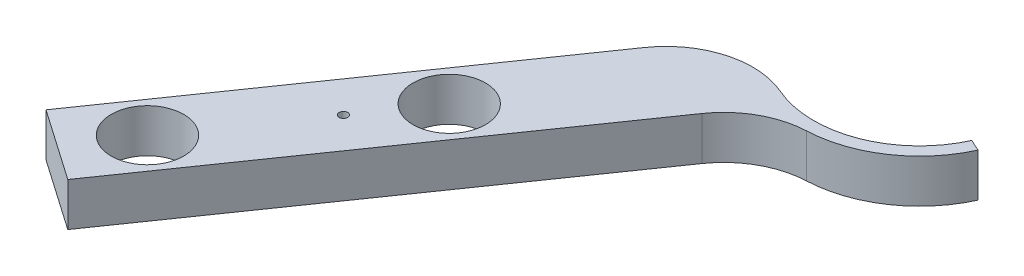
ISO-10303-21;
HEADER;
FILE_DESCRIPTION(('STEP AP214'),'2;1');
FILE_NAME('part.step','',(''),(''),'','','');
FILE_SCHEMA(('AUTOMOTIVE_DESIGN { 1 0 10303 214 1 1 1 1 }'));
ENDSEC;
DATA;
#1=APPLICATION_CONTEXT('core data for automotive mechanical design processes');
#2=APPLICATION_PROTOCOL_DEFINITION('international standard','automotive_design',2000,#1);
#3=PRODUCT_CONTEXT('',#1,'mechanical');
#4=PRODUCT('Part','Part','',(#3));
#5=PRODUCT_RELATED_PRODUCT_CATEGORY('part','',(#4));
#6=PRODUCT_DEFINITION_FORMATION('','',#4);
#7=PRODUCT_DEFINITION_CONTEXT('part definition',#1,'design');
#8=PRODUCT_DEFINITION('design','',#6,#7);
#9=PRODUCT_DEFINITION_SHAPE('','',#8);
#10=(LENGTH_UNIT() NAMED_UNIT(*) SI_UNIT(.MILLI.,.METRE.));
#11=(NAMED_UNIT(*) PLANE_ANGLE_UNIT() SI_UNIT($,.RADIAN.));
#12=(NAMED_UNIT(*) SI_UNIT($,.STERADIAN.) SOLID_ANGLE_UNIT());
#13=UNCERTAINTY_MEASURE_WITH_UNIT(LENGTH_MEASURE(1.E-05),#10,'distance_accuracy_value','');
#14=(GEOMETRIC_REPRESENTATION_CONTEXT(3) GLOBAL_UNCERTAINTY_ASSIGNED_CONTEXT((#13)) GLOBAL_UNIT_ASSIGNED_CONTEXT((#10,
#11,#12)) REPRESENTATION_CONTEXT('',''));
#15=CARTESIAN_POINT('',(0.,0.,0.));
#16=DIRECTION('',(0.,0.,1.));
#17=DIRECTION('',(1.,0.,0.));
#18=AXIS2_PLACEMENT_3D('',#15,#16,#17);
#19=CARTESIAN_POINT('',(-20.9324494362962,5.,30.1441549069458));
#20=DIRECTION('',(-0.570377582984847,0.,0.821382622672506));
#21=DIRECTION('',(0.821382622672506,0.,0.570377582984847));
#22=AXIS2_PLACEMENT_3D('',#19,#20,#21);
#23=PLANE('',#22);
#24=DIRECTION('',(0.,1.,0.));
#25=VECTOR('',#24,1.);
#26=CARTESIAN_POINT('',(-16.8255363229338,0.,32.9960428218699));
#27=LINE('',#26,#25);
#28=CARTESIAN_POINT('',(-16.8255363229338,0.,32.9960428218699));
#29=VERTEX_POINT('',#28);
#30=CARTESIAN_POINT('',(-16.8255363229338,5.,32.9960428218699));
#31=VERTEX_POINT('',#30);
#32=EDGE_CURVE('E107',#29,#31,#27,.T.);
#33=ORIENTED_EDGE('',*,*,#32,.F.);
#34=DIRECTION('',(-0.821382622672506,0.,-0.570377582984847));
#35=VECTOR('',#34,1.);
#36=CARTESIAN_POINT('',(-20.9324494362962,0.,30.1441549069458));
#37=LINE('',#36,#35);
#38=CARTESIAN_POINT('',(-8.61171009620893,0.,38.6998186517183));
#39=VERTEX_POINT('',#38);
#40=EDGE_CURVE('E118',#39,#29,#37,.T.);
#41=ORIENTED_EDGE('',*,*,#40,.F.);
#42=DIRECTION('',(0.,-1.,0.));
#43=VECTOR('',#42,1.);
#44=CARTESIAN_POINT('',(-8.61171009620893,5.,38.6998186517183));
#45=LINE('',#44,#43);
#46=CARTESIAN_POINT('',(-8.61171009620893,5.,38.6998186517183));
#47=VERTEX_POINT('',#46);
#48=EDGE_CURVE('E136',#47,#39,#45,.T.);
#49=ORIENTED_EDGE('',*,*,#48,.F.);
#50=DIRECTION('',(-0.821382622672506,0.,-0.570377582984847));
#51=VECTOR('',#50,1.);
#52=CARTESIAN_POINT('',(-20.9324494362962,5.,30.1441549069458));
#53=LINE('',#52,#51);
#54=EDGE_CURVE('E120',#47,#31,#53,.T.);
#55=ORIENTED_EDGE('',*,*,#54,.T.);
#56=EDGE_LOOP('',(#33,#41,#49,#55));
#57=FACE_BOUND('',#56,.T.);
#58=ADVANCED_FACE('F41',(#57),#23,.T.);
#59=CARTESIAN_POINT('',(0.,5.,0.));
#60=DIRECTION('',(0.,1.,0.));
#61=DIRECTION('',(0.,0.,1.));
#62=AXIS2_PLACEMENT_3D('',#59,#60,#61);
#63=PLANE('',#62);
#64=CARTESIAN_POINT('',(28.5028160348005,5.,-22.3766137246644));
#65=DIRECTION('',(0.,-1.,0.));
#66=DIRECTION('',(-0.9369964700514,0.,0.34933882565672));
#67=AXIS2_PLACEMENT_3D('',#64,#65,#66);
#68=CIRCLE('',#67,12.1999999999996);
#69=CARTESIAN_POINT('',(39.599648242593,5.,-17.30706591918));
#70=VERTEX_POINT('',#69);
#71=CARTESIAN_POINT('',(23.6433728637027,5.,-11.1861797711994));
#72=VERTEX_POINT('',#71);
#73=EDGE_CURVE('E194',#70,#72,#68,.T.);
#74=ORIENTED_EDGE('',*,*,#73,.T.);
#75=CARTESIAN_POINT('',(19.6602227234585,5.,-2.01369292409668));
#76=DIRECTION('',(0.,1.,0.));
#77=DIRECTION('',(0.,0.,1.));
#78=AXIS2_PLACEMENT_3D('',#75,#76,#77);
#79=CIRCLE('',#78,10.);
#80=CARTESIAN_POINT('',(11.4463964967335,5.,-7.71746875394519));
#81=VERTEX_POINT('',#80);
#82=EDGE_CURVE('E65',#72,#81,#79,.T.);
#83=ORIENTED_EDGE('',*,*,#82,.T.);
#84=DIRECTION('',(0.57037758298485,0.,-0.821382622672504));
#85=VECTOR('',#84,1.);
#86=CARTESIAN_POINT('',(4.10691311336246,5.,2.85188791492421));
#87=LINE('',#86,#85);
#88=EDGE_CURVE('E190',#31,#81,#87,.T.);
#89=ORIENTED_EDGE('',*,*,#88,.F.);
#90=ORIENTED_EDGE('',*,*,#54,.F.);
#91=DIRECTION('',(0.570377582984853,0.,-0.821382622672501));
#92=VECTOR('',#91,1.);
#93=CARTESIAN_POINT('',(12.3207393400874,5.,8.55566374477269));
#94=LINE('',#93,#92);
#95=CARTESIAN_POINT('',(21.3550995541448,5.,-4.45443116105676));
#96=VERTEX_POINT('',#95);
#97=EDGE_CURVE('E177',#47,#96,#94,.T.);
#98=ORIENTED_EDGE('',*,*,#97,.T.);
#99=CARTESIAN_POINT('',(29.5689257808698,5.,1.24934466879177));
#100=DIRECTION('',(0.,1.,0.));
#101=DIRECTION('',(0.,0.,1.));
#102=AXIS2_PLACEMENT_3D('',#99,#100,#101);
#103=CIRCLE('',#102,10.);
#104=CARTESIAN_POINT('',(29.1181394188955,5.,-8.74048974704606));
#105=VERTEX_POINT('',#104);
#106=EDGE_CURVE('E11',#96,#105,#103,.F.);
#107=ORIENTED_EDGE('',*,*,#106,.T.);
#108=CARTESIAN_POINT('',(28.5028160348005,5.,-22.3766137246644));
#109=DIRECTION('',(0.,-1.,0.));
#110=DIRECTION('',(-0.9369964700514,0.,0.34933882565672));
#111=AXIS2_PLACEMENT_3D('',#108,#109,#110);
#112=CIRCLE('',#111,13.6499999999997);
#113=CARTESIAN_POINT('',(40.9185340377765,5.,-16.7045376963993));
#114=VERTEX_POINT('',#113);
#115=EDGE_CURVE('E176',#114,#105,#112,.T.);
#116=ORIENTED_EDGE('',*,*,#115,.F.);
#117=DIRECTION('',(-0.909576410474816,0.,-0.415536705367587));
#118=VECTOR('',#117,1.);
#119=CARTESIAN_POINT('',(22.330472389426,5.,-25.19642667634));
#120=LINE('',#119,#118);
#121=EDGE_CURVE('E219',#114,#70,#120,.T.);
#122=ORIENTED_EDGE('',*,*,#121,.T.);
#123=EDGE_LOOP('',(#74,#83,#89,#90,#98,#107,#116,#122));
#124=FACE_BOUND('',#123,.T.);
#125=CARTESIAN_POINT('',(0.832992511570855,5.,16.3624609061356));
#126=DIRECTION('',(0.,-1.,0.));
#127=DIRECTION('',(-0.9369964700514,0.,0.34933882565672));
#128=AXIS2_PLACEMENT_3D('',#125,#126,#127);
#129=CIRCLE('',#128,0.500000000000001);
#130=CARTESIAN_POINT('',(0.364494276545154,5.,16.537130318964));
#131=VERTEX_POINT('',#130);
#132=EDGE_CURVE('E122',#131,#131,#129,.T.);
#133=ORIENTED_EDGE('',*,*,#132,.T.);
#134=EDGE_LOOP('',(#133));
#135=FACE_BOUND('',#134,.T.);
#136=CARTESIAN_POINT('',(5.81864823743628,5.,9.15299549993773));
#137=DIRECTION('',(0.,-1.,0.));
#138=DIRECTION('',(-0.9369964700514,0.,0.34933882565672));
#139=AXIS2_PLACEMENT_3D('',#136,#137,#138);
#140=CIRCLE('',#139,4.175);
#141=CARTESIAN_POINT('',(1.90668797497168,5.,10.6114850970545));
#142=VERTEX_POINT('',#141);
#143=EDGE_CURVE('E183',#142,#142,#140,.T.);
#144=ORIENTED_EDGE('',*,*,#143,.T.);
#145=EDGE_LOOP('',(#144));
#146=FACE_BOUND('',#145,.T.);
#147=CARTESIAN_POINT('',(-8.44079133718505,5.,29.6875610667503));
#148=DIRECTION('',(0.,-1.,0.));
#149=DIRECTION('',(-0.9369964700514,0.,0.34933882565672));
#150=AXIS2_PLACEMENT_3D('',#147,#148,#149);
#151=CIRCLE('',#150,4.175);
#152=CARTESIAN_POINT('',(-12.3527515996496,5.,31.1460506638671));
#153=VERTEX_POINT('',#152);
#154=EDGE_CURVE('E188',#153,#153,#151,.T.);
#155=ORIENTED_EDGE('',*,*,#154,.T.);
#156=EDGE_LOOP('',(#155));
#157=FACE_BOUND('',#156,.T.);
#158=ADVANCED_FACE('F173',(#124,#135,#146,#157),#63,.T.);
#159=CARTESIAN_POINT('',(0.,0.,0.));
#160=DIRECTION('',(0.,1.,0.));
#161=DIRECTION('',(0.,0.,1.));
#162=AXIS2_PLACEMENT_3D('',#159,#160,#161);
#163=PLANE('',#162);
#164=CARTESIAN_POINT('',(0.832992511570855,0.,16.3624609061356));
#165=DIRECTION('',(0.,-1.,0.));
#166=DIRECTION('',(-0.9369964700514,0.,0.34933882565672));
#167=AXIS2_PLACEMENT_3D('',#164,#165,#166);
#168=CIRCLE('',#167,0.500000000000001);
#169=CARTESIAN_POINT('',(0.364494276545154,0.,16.537130318964));
#170=VERTEX_POINT('',#169);
#171=EDGE_CURVE('E205',#170,#170,#168,.T.);
#172=ORIENTED_EDGE('',*,*,#171,.F.);
#173=EDGE_LOOP('',(#172));
#174=FACE_BOUND('',#173,.T.);
#175=DIRECTION('',(0.57037758298485,0.,-0.821382622672504));
#176=VECTOR('',#175,1.);
#177=CARTESIAN_POINT('',(4.10691311336246,0.,2.85188791492421));
#178=LINE('',#177,#176);
#179=CARTESIAN_POINT('',(11.4463964967335,0.,-7.71746875394519));
#180=VERTEX_POINT('',#179);
#181=EDGE_CURVE('E104',#29,#180,#178,.T.);
#182=ORIENTED_EDGE('',*,*,#181,.T.);
#183=CARTESIAN_POINT('',(19.6602227234585,0.,-2.01369292409668));
#184=DIRECTION('',(0.,1.,0.));
#185=DIRECTION('',(0.,0.,1.));
#186=AXIS2_PLACEMENT_3D('',#183,#184,#185);
#187=CIRCLE('',#186,10.);
#188=CARTESIAN_POINT('',(23.6433728637027,0.,-11.1861797711994));
#189=VERTEX_POINT('',#188);
#190=EDGE_CURVE('E153',#180,#189,#187,.F.);
#191=ORIENTED_EDGE('',*,*,#190,.T.);
#192=CARTESIAN_POINT('',(28.5028160348005,0.,-22.3766137246644));
#193=DIRECTION('',(0.,-1.,0.));
#194=DIRECTION('',(-0.9369964700514,0.,0.34933882565672));
#195=AXIS2_PLACEMENT_3D('',#192,#193,#194);
#196=CIRCLE('',#195,12.1999999999996);
#197=CARTESIAN_POINT('',(39.599648242593,0.,-17.30706591918));
#198=VERTEX_POINT('',#197);
#199=EDGE_CURVE('E114',#198,#189,#196,.T.);
#200=ORIENTED_EDGE('',*,*,#199,.F.);
#201=DIRECTION('',(-0.909576410474816,0.,-0.415536705367587));
#202=VECTOR('',#201,1.);
#203=CARTESIAN_POINT('',(22.330472389426,0.,-25.19642667634));
#204=LINE('',#203,#202);
#205=CARTESIAN_POINT('',(40.9185340377765,0.,-16.7045376963993));
#206=VERTEX_POINT('',#205);
#207=EDGE_CURVE('E201',#206,#198,#204,.T.);
#208=ORIENTED_EDGE('',*,*,#207,.F.);
#209=CARTESIAN_POINT('',(28.5028160348005,0.,-22.3766137246644));
#210=DIRECTION('',(0.,-1.,0.));
#211=DIRECTION('',(-0.9369964700514,0.,0.34933882565672));
#212=AXIS2_PLACEMENT_3D('',#209,#210,#211);
#213=CIRCLE('',#212,13.6499999999997);
#214=CARTESIAN_POINT('',(29.1181394188955,0.,-8.74048974704606));
#215=VERTEX_POINT('',#214);
#216=EDGE_CURVE('E159',#206,#215,#213,.T.);
#217=ORIENTED_EDGE('',*,*,#216,.T.);
#218=CARTESIAN_POINT('',(29.5689257808698,0.,1.24934466879177));
#219=DIRECTION('',(0.,1.,0.));
#220=DIRECTION('',(0.,0.,1.));
#221=AXIS2_PLACEMENT_3D('',#218,#219,#220);
#222=CIRCLE('',#221,10.);
#223=CARTESIAN_POINT('',(21.3550995541448,0.,-4.45443116105676));
#224=VERTEX_POINT('',#223);
#225=EDGE_CURVE('E50',#215,#224,#222,.T.);
#226=ORIENTED_EDGE('',*,*,#225,.T.);
#227=DIRECTION('',(0.570377582984853,0.,-0.821382622672501));
#228=VECTOR('',#227,1.);
#229=CARTESIAN_POINT('',(12.3207393400874,0.,8.55566374477269));
#230=LINE('',#229,#228);
#231=EDGE_CURVE('E113',#39,#224,#230,.T.);
#232=ORIENTED_EDGE('',*,*,#231,.F.);
#233=ORIENTED_EDGE('',*,*,#40,.T.);
#234=EDGE_LOOP('',(#182,#191,#200,#208,#217,#226,#232,#233));
#235=FACE_BOUND('',#234,.T.);
#236=CARTESIAN_POINT('',(5.81864823743628,0.,9.15299549993773));
#237=DIRECTION('',(0.,-1.,0.));
#238=DIRECTION('',(-0.9369964700514,0.,0.34933882565672));
#239=AXIS2_PLACEMENT_3D('',#236,#237,#238);
#240=CIRCLE('',#239,4.175);
#241=CARTESIAN_POINT('',(1.90668797497168,0.,10.6114850970545));
#242=VERTEX_POINT('',#241);
#243=EDGE_CURVE('E210',#242,#242,#240,.T.);
#244=ORIENTED_EDGE('',*,*,#243,.F.);
#245=EDGE_LOOP('',(#244));
#246=FACE_BOUND('',#245,.T.);
#247=CARTESIAN_POINT('',(-8.44079133718505,0.,29.6875610667503));
#248=DIRECTION('',(0.,-1.,0.));
#249=DIRECTION('',(-0.9369964700514,0.,0.34933882565672));
#250=AXIS2_PLACEMENT_3D('',#247,#248,#249);
#251=CIRCLE('',#250,4.175);
#252=CARTESIAN_POINT('',(-12.3527515996496,0.,31.1460506638671));
#253=VERTEX_POINT('',#252);
#254=EDGE_CURVE('E215',#253,#253,#251,.T.);
#255=ORIENTED_EDGE('',*,*,#254,.F.);
#256=EDGE_LOOP('',(#255));
#257=FACE_BOUND('',#256,.T.);
#258=ADVANCED_FACE('F125',(#174,#235,#246,#257),#163,.F.);
#259=CARTESIAN_POINT('',(22.330472389426,5.,-25.19642667634));
#260=DIRECTION('',(-0.415536705367587,0.,0.909576410474816));
#261=DIRECTION('',(0.909576410474816,0.,0.415536705367587));
#262=AXIS2_PLACEMENT_3D('',#259,#260,#261);
#263=PLANE('',#262);
#264=ORIENTED_EDGE('',*,*,#207,.T.);
#265=DIRECTION('',(0.,-1.,0.));
#266=VECTOR('',#265,1.);
#267=CARTESIAN_POINT('',(39.599648242593,5.,-17.30706591918));
#268=LINE('',#267,#266);
#269=EDGE_CURVE('E129',#70,#198,#268,.T.);
#270=ORIENTED_EDGE('',*,*,#269,.F.);
#271=ORIENTED_EDGE('',*,*,#121,.F.);
#272=DIRECTION('',(0.,-1.,0.));
#273=VECTOR('',#272,1.);
#274=CARTESIAN_POINT('',(40.9185340377765,5.,-16.7045376963993));
#275=LINE('',#274,#273);
#276=EDGE_CURVE('E180',#114,#206,#275,.T.);
#277=ORIENTED_EDGE('',*,*,#276,.T.);
#278=EDGE_LOOP('',(#264,#270,#271,#277));
#279=FACE_BOUND('',#278,.T.);
#280=ADVANCED_FACE('F224',(#279),#263,.F.);
#281=CARTESIAN_POINT('',(28.5028160348005,5.,-22.3766137246644));
#282=DIRECTION('',(0.,-1.,0.));
#283=DIRECTION('',(0.,0.,-1.));
#284=AXIS2_PLACEMENT_3D('',#281,#282,#283);
#285=CYLINDRICAL_SURFACE('',#284,12.1999999999996);
#286=ORIENTED_EDGE('',*,*,#199,.T.);
#287=DIRECTION('',(0.,-1.,0.));
#288=VECTOR('',#287,1.);
#289=CARTESIAN_POINT('',(23.6433728637027,5.,-11.1861797711994));
#290=LINE('',#289,#288);
#291=EDGE_CURVE('E145',#189,#72,#290,.F.);
#292=ORIENTED_EDGE('',*,*,#291,.T.);
#293=ORIENTED_EDGE('',*,*,#73,.F.);
#294=ORIENTED_EDGE('',*,*,#269,.T.);
#295=EDGE_LOOP('',(#286,#292,#293,#294));
#296=FACE_BOUND('',#295,.T.);
#297=ADVANCED_FACE('F228',(#296),#285,.F.);
#298=CARTESIAN_POINT('',(4.10691311336246,5.,2.85188791492421));
#299=DIRECTION('',(-0.821382622672504,0.,-0.57037758298485));
#300=DIRECTION('',(-0.57037758298485,0.,0.821382622672504));
#301=AXIS2_PLACEMENT_3D('',#298,#299,#300);
#302=PLANE('',#301);
#303=ORIENTED_EDGE('',*,*,#88,.T.);
#304=DIRECTION('',(0.,1.,0.));
#305=VECTOR('',#304,1.);
#306=CARTESIAN_POINT('',(11.4463964967335,0.,-7.71746875394519));
#307=LINE('',#306,#305);
#308=EDGE_CURVE('E57',#81,#180,#307,.F.);
#309=ORIENTED_EDGE('',*,*,#308,.T.);
#310=ORIENTED_EDGE('',*,*,#181,.F.);
#311=ORIENTED_EDGE('',*,*,#32,.T.);
#312=EDGE_LOOP('',(#303,#309,#310,#311));
#313=FACE_BOUND('',#312,.T.);
#314=ADVANCED_FACE('F106',(#313),#302,.T.);
#315=CARTESIAN_POINT('',(12.3207393400874,5.,8.55566374477269));
#316=DIRECTION('',(-0.821382622672501,0.,-0.570377582984853));
#317=DIRECTION('',(-0.570377582984853,0.,0.821382622672502));
#318=AXIS2_PLACEMENT_3D('',#315,#316,#317);
#319=PLANE('',#318);
#320=ORIENTED_EDGE('',*,*,#231,.T.);
#321=DIRECTION('',(0.,-1.,0.));
#322=VECTOR('',#321,1.);
#323=CARTESIAN_POINT('',(21.3550995541448,5.,-4.45443116105676));
#324=LINE('',#323,#322);
#325=EDGE_CURVE('E142',#224,#96,#324,.F.);
#326=ORIENTED_EDGE('',*,*,#325,.T.);
#327=ORIENTED_EDGE('',*,*,#97,.F.);
#328=ORIENTED_EDGE('',*,*,#48,.T.);
#329=EDGE_LOOP('',(#320,#326,#327,#328));
#330=FACE_BOUND('',#329,.T.);
#331=ADVANCED_FACE('F164',(#330),#319,.F.);
#332=CARTESIAN_POINT('',(5.81864823743628,5.,9.15299549993773));
#333=DIRECTION('',(0.,-1.,0.));
#334=DIRECTION('',(0.,0.,-1.));
#335=AXIS2_PLACEMENT_3D('',#332,#333,#334);
#336=CYLINDRICAL_SURFACE('',#335,4.175);
#337=ORIENTED_EDGE('',*,*,#143,.F.);
#338=EDGE_LOOP('',(#337));
#339=FACE_BOUND('',#338,.T.);
#340=ORIENTED_EDGE('',*,*,#243,.T.);
#341=EDGE_LOOP('',(#340));
#342=FACE_BOUND('',#341,.T.);
#343=ADVANCED_FACE('F268',(#339,#342),#336,.F.);
#344=CARTESIAN_POINT('',(28.5028160348005,5.,-22.3766137246644));
#345=DIRECTION('',(0.,-1.,0.));
#346=DIRECTION('',(0.,0.,-1.));
#347=AXIS2_PLACEMENT_3D('',#344,#345,#346);
#348=CYLINDRICAL_SURFACE('',#347,13.6499999999997);
#349=ORIENTED_EDGE('',*,*,#115,.T.);
#350=DIRECTION('',(0.,-1.,0.));
#351=VECTOR('',#350,1.);
#352=CARTESIAN_POINT('',(29.1181394188955,5.,-8.74048974704606));
#353=LINE('',#352,#351);
#354=EDGE_CURVE('E133',#105,#215,#353,.T.);
#355=ORIENTED_EDGE('',*,*,#354,.T.);
#356=ORIENTED_EDGE('',*,*,#216,.F.);
#357=ORIENTED_EDGE('',*,*,#276,.F.);
#358=EDGE_LOOP('',(#349,#355,#356,#357));
#359=FACE_BOUND('',#358,.T.);
#360=ADVANCED_FACE('F179',(#359),#348,.T.);
#361=CARTESIAN_POINT('',(-8.44079133718505,5.,29.6875610667503));
#362=DIRECTION('',(0.,-1.,0.));
#363=DIRECTION('',(0.,0.,-1.));
#364=AXIS2_PLACEMENT_3D('',#361,#362,#363);
#365=CYLINDRICAL_SURFACE('',#364,4.175);
#366=ORIENTED_EDGE('',*,*,#154,.F.);
#367=EDGE_LOOP('',(#366));
#368=FACE_BOUND('',#367,.T.);
#369=ORIENTED_EDGE('',*,*,#254,.T.);
#370=EDGE_LOOP('',(#369));
#371=FACE_BOUND('',#370,.T.);
#372=ADVANCED_FACE('F260',(#368,#371),#365,.F.);
#373=CARTESIAN_POINT('',(0.832992511570855,0.,16.3624609061356));
#374=DIRECTION('',(0.,1.,0.));
#375=DIRECTION('',(0.,0.,1.));
#376=AXIS2_PLACEMENT_3D('',#373,#374,#375);
#377=CYLINDRICAL_SURFACE('',#376,0.500000000000001);
#378=ORIENTED_EDGE('',*,*,#171,.T.);
#379=EDGE_LOOP('',(#378));
#380=FACE_BOUND('',#379,.T.);
#381=ORIENTED_EDGE('',*,*,#132,.F.);
#382=EDGE_LOOP('',(#381));
#383=FACE_BOUND('',#382,.T.);
#384=ADVANCED_FACE('F239',(#380,#383),#377,.F.);
#385=CARTESIAN_POINT('',(29.5689257808698,5.,1.24934466879177));
#386=DIRECTION('',(0.,-1.,0.));
#387=DIRECTION('',(0.,0.,-1.));
#388=AXIS2_PLACEMENT_3D('',#385,#386,#387);
#389=CYLINDRICAL_SURFACE('',#388,10.);
#390=ORIENTED_EDGE('',*,*,#106,.F.);
#391=ORIENTED_EDGE('',*,*,#325,.F.);
#392=ORIENTED_EDGE('',*,*,#225,.F.);
#393=ORIENTED_EDGE('',*,*,#354,.F.);
#394=EDGE_LOOP('',(#390,#391,#392,#393));
#395=FACE_BOUND('',#394,.T.);
#396=ADVANCED_FACE('F170',(#395),#389,.F.);
#397=CARTESIAN_POINT('',(19.6602227234585,5.,-2.01369292409668));
#398=DIRECTION('',(0.,-1.,0.));
#399=DIRECTION('',(0.,0.,-1.));
#400=AXIS2_PLACEMENT_3D('',#397,#398,#399);
#401=CYLINDRICAL_SURFACE('',#400,10.);
#402=ORIENTED_EDGE('',*,*,#190,.F.);
#403=ORIENTED_EDGE('',*,*,#308,.F.);
#404=ORIENTED_EDGE('',*,*,#82,.F.);
#405=ORIENTED_EDGE('',*,*,#291,.F.);
#406=EDGE_LOOP('',(#402,#403,#404,#405));
#407=FACE_BOUND('',#406,.T.);
#408=ADVANCED_FACE('F43',(#407),#401,.T.);
#409=CLOSED_SHELL('',(#58,#158,#258,#280,#297,#314,#331,#343,#360,#372,#384,#396,#408));
#410=MANIFOLD_SOLID_BREP('B2',#409);
#411=ADVANCED_BREP_SHAPE_REPRESENTATION('',(#18,#410),#14);
#412=SHAPE_DEFINITION_REPRESENTATION(#9,#411);
ENDSEC;
END-ISO-10303-21;
